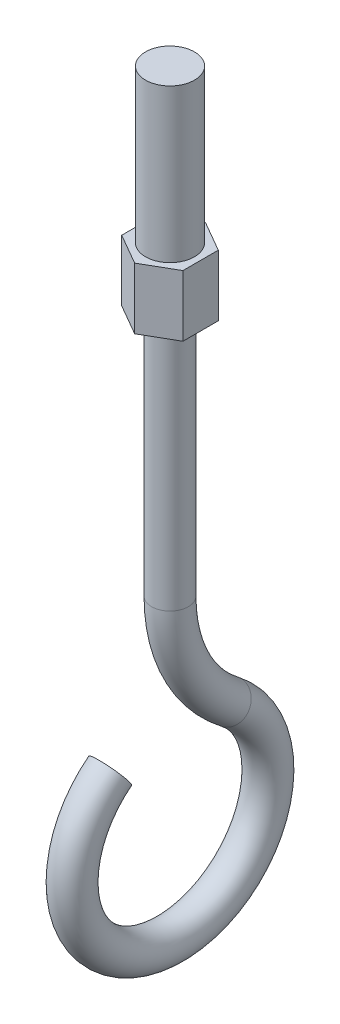
ISO-10303-21;
HEADER;
FILE_DESCRIPTION(('STEP AP214'),'2;1');
FILE_NAME('part.step','',(''),(''),'','','');
FILE_SCHEMA(('AUTOMOTIVE_DESIGN { 1 0 10303 214 1 1 1 1 }'));
ENDSEC;
DATA;
#1=APPLICATION_CONTEXT('core data for automotive mechanical design processes');
#2=APPLICATION_PROTOCOL_DEFINITION('international standard','automotive_design',2000,#1);
#3=PRODUCT_CONTEXT('',#1,'mechanical');
#4=PRODUCT('Part','Part','',(#3));
#5=PRODUCT_RELATED_PRODUCT_CATEGORY('part','',(#4));
#6=PRODUCT_DEFINITION_FORMATION('','',#4);
#7=PRODUCT_DEFINITION_CONTEXT('part definition',#1,'design');
#8=PRODUCT_DEFINITION('design','',#6,#7);
#9=PRODUCT_DEFINITION_SHAPE('','',#8);
#10=(LENGTH_UNIT() NAMED_UNIT(*) SI_UNIT(.MILLI.,.METRE.));
#11=(NAMED_UNIT(*) PLANE_ANGLE_UNIT() SI_UNIT($,.RADIAN.));
#12=(NAMED_UNIT(*) SI_UNIT($,.STERADIAN.) SOLID_ANGLE_UNIT());
#13=UNCERTAINTY_MEASURE_WITH_UNIT(LENGTH_MEASURE(1.E-05),#10,'distance_accuracy_value','');
#14=(GEOMETRIC_REPRESENTATION_CONTEXT(3) GLOBAL_UNCERTAINTY_ASSIGNED_CONTEXT((#13)) GLOBAL_UNIT_ASSIGNED_CONTEXT((#10,
#11,#12)) REPRESENTATION_CONTEXT('',''));
#15=CARTESIAN_POINT('',(0.,0.,0.));
#16=DIRECTION('',(0.,0.,1.));
#17=DIRECTION('',(1.,0.,0.));
#18=AXIS2_PLACEMENT_3D('',#15,#16,#17);
#19=CARTESIAN_POINT('',(0.,-75.9647043265553,12.390243902439));
#20=DIRECTION('',(0.,-0.609756097560976,0.79258911264741));
#21=DIRECTION('',(0.,-0.79258911264741,-0.609756097560976));
#22=AXIS2_PLACEMENT_3D('',#19,#20,#21);
#23=PLANE('',#22);
#24=CARTESIAN_POINT('',(0.,-75.9647043265553,12.390243902439));
#25=DIRECTION('',(0.,-0.609756097560976,0.79258911264741));
#26=DIRECTION('',(0.,-0.79258911264741,-0.609756097560976));
#27=AXIS2_PLACEMENT_3D('',#24,#25,#26);
#28=CIRCLE('',#27,3.81);
#29=CARTESIAN_POINT('',(0.,-78.9844688457419,10.0670731707317));
#30=VERTEX_POINT('',#29);
#31=EDGE_CURVE('E12',#30,#30,#28,.T.);
#32=ORIENTED_EDGE('',*,*,#31,.F.);
#33=EDGE_LOOP('',(#32));
#34=FACE_BOUND('',#33,.T.);
#35=ADVANCED_FACE('F46',(#34),#23,.F.);
#36=CARTESIAN_POINT('',(0.,0.,0.));
#37=DIRECTION('',(0.,-1.,0.));
#38=DIRECTION('',(0.,0.,-1.));
#39=AXIS2_PLACEMENT_3D('',#36,#37,#38);
#40=CYLINDRICAL_SURFACE('',#39,3.81);
#41=CARTESIAN_POINT('',(0.,-50.8,0.));
#42=DIRECTION('',(0.,1.,0.));
#43=DIRECTION('',(0.,0.,1.));
#44=AXIS2_PLACEMENT_3D('',#41,#42,#43);
#45=CIRCLE('',#44,3.81);
#46=CARTESIAN_POINT('',(0.,-50.8,3.81));
#47=VERTEX_POINT('',#46);
#48=EDGE_CURVE('E158',#47,#47,#45,.T.);
#49=ORIENTED_EDGE('',*,*,#48,.T.);
#50=EDGE_LOOP('',(#49));
#51=FACE_BOUND('',#50,.T.);
#52=CARTESIAN_POINT('',(0.,0.,0.));
#53=DIRECTION('',(0.,1.,0.));
#54=DIRECTION('',(0.,0.,1.));
#55=AXIS2_PLACEMENT_3D('',#52,#53,#54);
#56=CIRCLE('',#55,3.81);
#57=CARTESIAN_POINT('',(0.,0.,3.81));
#58=VERTEX_POINT('',#57);
#59=EDGE_CURVE('E155',#58,#58,#56,.T.);
#60=ORIENTED_EDGE('',*,*,#59,.F.);
#61=EDGE_LOOP('',(#60));
#62=FACE_BOUND('',#61,.T.);
#63=ADVANCED_FACE('F176',(#51,#62),#40,.T.);
#64=CARTESIAN_POINT('',(0.,-50.8,-31.75));
#65=DIRECTION('',(1.,0.,0.));
#66=DIRECTION('',(0.,0.,-1.));
#67=AXIS2_PLACEMENT_3D('',#64,#65,#66);
#68=TOROIDAL_SURFACE('',#67,31.75,3.81);
#69=CARTESIAN_POINT('',(0.,-75.9647043265553,-12.390243902439));
#70=DIRECTION('',(0.,0.609756097560976,0.79258911264741));
#71=DIRECTION('',(0.,-0.79258911264741,0.609756097560976));
#72=AXIS2_PLACEMENT_3D('',#69,#70,#71);
#73=CIRCLE('',#72,3.81);
#74=CARTESIAN_POINT('',(0.,-78.9844688457419,-10.0670731707317));
#75=VERTEX_POINT('',#74);
#76=EDGE_CURVE('E54',#75,#75,#73,.T.);
#77=CARTESIAN_POINT('',(0.,-50.8,-31.75));
#78=DIRECTION('',(1.,0.,0.));
#79=DIRECTION('',(0.,0.,-1.));
#80=AXIS2_PLACEMENT_3D('',#77,#78,#79);
#81=CIRCLE('',#80,35.56);
#82=EDGE_CURVE('',#47,#75,#81,.T.);
#83=ORIENTED_EDGE('',*,*,#48,.F.);
#84=ORIENTED_EDGE('',*,*,#76,.T.);
#85=ORIENTED_EDGE('',*,*,#82,.T.);
#86=ORIENTED_EDGE('',*,*,#82,.F.);
#87=EDGE_LOOP('',(#83,#85,#84,#86));
#88=FACE_BOUND('',#87,.T.);
#89=ADVANCED_FACE('F163',(#88),#68,.T.);
#90=CARTESIAN_POINT('',(0.,-92.0701150955507,0.));
#91=DIRECTION('',(-1.,0.,0.));
#92=DIRECTION('',(0.,0.,1.));
#93=AXIS2_PLACEMENT_3D('',#90,#91,#92);
#94=TOROIDAL_SURFACE('',#93,20.32,3.81);
#95=ORIENTED_EDGE('',*,*,#31,.T.);
#96=EDGE_LOOP('',(#95));
#97=FACE_BOUND('',#96,.T.);
#98=ORIENTED_EDGE('',*,*,#76,.F.);
#99=EDGE_LOOP('',(#98));
#100=FACE_BOUND('',#99,.T.);
#101=ADVANCED_FACE('F166',(#97,#100),#94,.T.);
#102=CARTESIAN_POINT('',(0.,0.,0.));
#103=DIRECTION('',(0.,1.,0.));
#104=DIRECTION('',(0.,0.,1.));
#105=AXIS2_PLACEMENT_3D('',#102,#103,#104);
#106=PLANE('',#105);
#107=ORIENTED_EDGE('',*,*,#59,.T.);
#108=EDGE_LOOP('',(#107));
#109=FACE_BOUND('',#108,.T.);
#110=DIRECTION('',(0.,0.,-1.));
#111=VECTOR('',#110,1.);
#112=CARTESIAN_POINT('',(6.35,0.,3.66617420935413));
#113=LINE('',#112,#111);
#114=CARTESIAN_POINT('',(6.35,0.,3.66617420935413));
#115=VERTEX_POINT('',#114);
#116=CARTESIAN_POINT('',(6.35,0.,-3.66617420935412));
#117=VERTEX_POINT('',#116);
#118=EDGE_CURVE('E132',#115,#117,#113,.T.);
#119=ORIENTED_EDGE('',*,*,#118,.F.);
#120=DIRECTION('',(0.866025403784439,0.,-0.5));
#121=VECTOR('',#120,1.);
#122=CARTESIAN_POINT('',(0.,0.,7.33234841870825));
#123=LINE('',#122,#121);
#124=CARTESIAN_POINT('',(0.,0.,7.33234841870825));
#125=VERTEX_POINT('',#124);
#126=EDGE_CURVE('E91',#125,#115,#123,.T.);
#127=ORIENTED_EDGE('',*,*,#126,.F.);
#128=DIRECTION('',(0.866025403784438,0.,0.5));
#129=VECTOR('',#128,1.);
#130=CARTESIAN_POINT('',(-6.35,0.,3.66617420935413));
#131=LINE('',#130,#129);
#132=CARTESIAN_POINT('',(-6.35,0.,3.66617420935413));
#133=VERTEX_POINT('',#132);
#134=EDGE_CURVE('E85',#133,#125,#131,.T.);
#135=ORIENTED_EDGE('',*,*,#134,.F.);
#136=DIRECTION('',(0.,0.,1.));
#137=VECTOR('',#136,1.);
#138=CARTESIAN_POINT('',(-6.35,0.,-3.66617420935413));
#139=LINE('',#138,#137);
#140=CARTESIAN_POINT('',(-6.35,0.,-3.66617420935413));
#141=VERTEX_POINT('',#140);
#142=EDGE_CURVE('E122',#141,#133,#139,.T.);
#143=ORIENTED_EDGE('',*,*,#142,.F.);
#144=DIRECTION('',(-0.866025403784439,0.,0.5));
#145=VECTOR('',#144,1.);
#146=CARTESIAN_POINT('',(0.,0.,-7.33234841870825));
#147=LINE('',#146,#145);
#148=CARTESIAN_POINT('',(0.,0.,-7.33234841870825));
#149=VERTEX_POINT('',#148);
#150=EDGE_CURVE('E138',#149,#141,#147,.T.);
#151=ORIENTED_EDGE('',*,*,#150,.F.);
#152=DIRECTION('',(-0.866025403784438,0.,-0.5));
#153=VECTOR('',#152,1.);
#154=CARTESIAN_POINT('',(6.35,0.,-3.66617420935412));
#155=LINE('',#154,#153);
#156=EDGE_CURVE('E135',#117,#149,#155,.T.);
#157=ORIENTED_EDGE('',*,*,#156,.F.);
#158=EDGE_LOOP('',(#119,#127,#135,#143,#151,#157));
#159=FACE_BOUND('',#158,.T.);
#160=ADVANCED_FACE('F168',(#109,#159),#106,.F.);
#161=CARTESIAN_POINT('',(0.,12.7,0.));
#162=DIRECTION('',(0.,1.,0.));
#163=DIRECTION('',(0.,0.,1.));
#164=AXIS2_PLACEMENT_3D('',#161,#162,#163);
#165=PLANE('',#164);
#166=DIRECTION('',(0.,0.,-1.));
#167=VECTOR('',#166,1.);
#168=CARTESIAN_POINT('',(6.35,12.7,3.66617420935413));
#169=LINE('',#168,#167);
#170=CARTESIAN_POINT('',(6.35,12.7,3.66617420935413));
#171=VERTEX_POINT('',#170);
#172=CARTESIAN_POINT('',(6.35,12.7,-3.66617420935412));
#173=VERTEX_POINT('',#172);
#174=EDGE_CURVE('E143',#171,#173,#169,.T.);
#175=ORIENTED_EDGE('',*,*,#174,.T.);
#176=DIRECTION('',(-0.866025403784438,0.,-0.5));
#177=VECTOR('',#176,1.);
#178=CARTESIAN_POINT('',(6.35,12.7,-3.66617420935412));
#179=LINE('',#178,#177);
#180=CARTESIAN_POINT('',(0.,12.7,-7.33234841870825));
#181=VERTEX_POINT('',#180);
#182=EDGE_CURVE('E100',#173,#181,#179,.T.);
#183=ORIENTED_EDGE('',*,*,#182,.T.);
#184=DIRECTION('',(-0.866025403784439,0.,0.5));
#185=VECTOR('',#184,1.);
#186=CARTESIAN_POINT('',(0.,12.7,-7.33234841870825));
#187=LINE('',#186,#185);
#188=CARTESIAN_POINT('',(-6.35,12.7,-3.66617420935412));
#189=VERTEX_POINT('',#188);
#190=EDGE_CURVE('E114',#181,#189,#187,.T.);
#191=ORIENTED_EDGE('',*,*,#190,.T.);
#192=DIRECTION('',(0.,0.,1.));
#193=VECTOR('',#192,1.);
#194=CARTESIAN_POINT('',(-6.35,12.7,-3.66617420935412));
#195=LINE('',#194,#193);
#196=CARTESIAN_POINT('',(-6.35,12.7,3.66617420935413));
#197=VERTEX_POINT('',#196);
#198=EDGE_CURVE('E107',#189,#197,#195,.T.);
#199=ORIENTED_EDGE('',*,*,#198,.T.);
#200=DIRECTION('',(0.866025403784438,0.,0.5));
#201=VECTOR('',#200,1.);
#202=CARTESIAN_POINT('',(-6.35,12.7,3.66617420935413));
#203=LINE('',#202,#201);
#204=CARTESIAN_POINT('',(0.,12.7,7.33234841870825));
#205=VERTEX_POINT('',#204);
#206=EDGE_CURVE('E112',#197,#205,#203,.T.);
#207=ORIENTED_EDGE('',*,*,#206,.T.);
#208=DIRECTION('',(0.866025403784439,0.,-0.5));
#209=VECTOR('',#208,1.);
#210=CARTESIAN_POINT('',(0.,12.7,7.33234841870825));
#211=LINE('',#210,#209);
#212=EDGE_CURVE('E62',#205,#171,#211,.T.);
#213=ORIENTED_EDGE('',*,*,#212,.T.);
#214=EDGE_LOOP('',(#175,#183,#191,#199,#207,#213));
#215=FACE_BOUND('',#214,.T.);
#216=CARTESIAN_POINT('',(0.,12.7,0.));
#217=DIRECTION('',(0.,1.,0.));
#218=DIRECTION('',(0.,0.,1.));
#219=AXIS2_PLACEMENT_3D('',#216,#217,#218);
#220=CIRCLE('',#219,5.08);
#221=CARTESIAN_POINT('',(0.,12.7,5.08));
#222=VERTEX_POINT('',#221);
#223=EDGE_CURVE('E136',#222,#222,#220,.T.);
#224=ORIENTED_EDGE('',*,*,#223,.F.);
#225=EDGE_LOOP('',(#224));
#226=FACE_BOUND('',#225,.T.);
#227=ADVANCED_FACE('F109',(#215,#226),#165,.T.);
#228=CARTESIAN_POINT('',(6.35,12.7,3.66617420935413));
#229=DIRECTION('',(-1.,0.,0.));
#230=DIRECTION('',(0.,0.,1.));
#231=AXIS2_PLACEMENT_3D('',#228,#229,#230);
#232=PLANE('',#231);
#233=ORIENTED_EDGE('',*,*,#118,.T.);
#234=DIRECTION('',(0.,-1.,0.));
#235=VECTOR('',#234,1.);
#236=CARTESIAN_POINT('',(6.35,12.7,-3.66617420935412));
#237=LINE('',#236,#235);
#238=EDGE_CURVE('E150',#173,#117,#237,.T.);
#239=ORIENTED_EDGE('',*,*,#238,.F.);
#240=ORIENTED_EDGE('',*,*,#174,.F.);
#241=DIRECTION('',(0.,-1.,0.));
#242=VECTOR('',#241,1.);
#243=CARTESIAN_POINT('',(6.35,12.7,3.66617420935413));
#244=LINE('',#243,#242);
#245=EDGE_CURVE('E128',#171,#115,#244,.T.);
#246=ORIENTED_EDGE('',*,*,#245,.T.);
#247=EDGE_LOOP('',(#233,#239,#240,#246));
#248=FACE_BOUND('',#247,.T.);
#249=ADVANCED_FACE('F191',(#248),#232,.F.);
#250=CARTESIAN_POINT('',(6.35,12.7,-3.66617420935412));
#251=DIRECTION('',(-0.5,0.,0.866025403784438));
#252=DIRECTION('',(0.866025403784439,0.,0.5));
#253=AXIS2_PLACEMENT_3D('',#250,#251,#252);
#254=PLANE('',#253);
#255=ORIENTED_EDGE('',*,*,#156,.T.);
#256=DIRECTION('',(0.,-1.,0.));
#257=VECTOR('',#256,1.);
#258=CARTESIAN_POINT('',(0.,12.7,-7.33234841870825));
#259=LINE('',#258,#257);
#260=EDGE_CURVE('E147',#181,#149,#259,.T.);
#261=ORIENTED_EDGE('',*,*,#260,.F.);
#262=ORIENTED_EDGE('',*,*,#182,.F.);
#263=ORIENTED_EDGE('',*,*,#238,.T.);
#264=EDGE_LOOP('',(#255,#261,#262,#263));
#265=FACE_BOUND('',#264,.T.);
#266=ADVANCED_FACE('F194',(#265),#254,.F.);
#267=CARTESIAN_POINT('',(0.,12.7,-7.33234841870825));
#268=DIRECTION('',(0.5,0.,0.866025403784439));
#269=DIRECTION('',(0.866025403784439,0.,-0.5));
#270=AXIS2_PLACEMENT_3D('',#267,#268,#269);
#271=PLANE('',#270);
#272=ORIENTED_EDGE('',*,*,#150,.T.);
#273=DIRECTION('',(0.,-1.,0.));
#274=VECTOR('',#273,1.);
#275=CARTESIAN_POINT('',(-6.35,12.7,-3.66617420935412));
#276=LINE('',#275,#274);
#277=EDGE_CURVE('E123',#189,#141,#276,.T.);
#278=ORIENTED_EDGE('',*,*,#277,.F.);
#279=ORIENTED_EDGE('',*,*,#190,.F.);
#280=ORIENTED_EDGE('',*,*,#260,.T.);
#281=EDGE_LOOP('',(#272,#278,#279,#280));
#282=FACE_BOUND('',#281,.T.);
#283=ADVANCED_FACE('F198',(#282),#271,.F.);
#284=CARTESIAN_POINT('',(-6.35,12.7,-3.66617420935412));
#285=DIRECTION('',(1.,0.,0.));
#286=DIRECTION('',(0.,0.,-1.));
#287=AXIS2_PLACEMENT_3D('',#284,#285,#286);
#288=PLANE('',#287);
#289=ORIENTED_EDGE('',*,*,#142,.T.);
#290=DIRECTION('',(0.,-1.,0.));
#291=VECTOR('',#290,1.);
#292=CARTESIAN_POINT('',(-6.35,12.7,3.66617420935413));
#293=LINE('',#292,#291);
#294=EDGE_CURVE('E119',#197,#133,#293,.T.);
#295=ORIENTED_EDGE('',*,*,#294,.F.);
#296=ORIENTED_EDGE('',*,*,#198,.F.);
#297=ORIENTED_EDGE('',*,*,#277,.T.);
#298=EDGE_LOOP('',(#289,#295,#296,#297));
#299=FACE_BOUND('',#298,.T.);
#300=ADVANCED_FACE('F120',(#299),#288,.F.);
#301=CARTESIAN_POINT('',(-6.35,12.7,3.66617420935413));
#302=DIRECTION('',(0.5,0.,-0.866025403784438));
#303=DIRECTION('',(-0.866025403784439,0.,-0.5));
#304=AXIS2_PLACEMENT_3D('',#301,#302,#303);
#305=PLANE('',#304);
#306=ORIENTED_EDGE('',*,*,#134,.T.);
#307=DIRECTION('',(0.,-1.,0.));
#308=VECTOR('',#307,1.);
#309=CARTESIAN_POINT('',(0.,12.7,7.33234841870825));
#310=LINE('',#309,#308);
#311=EDGE_CURVE('E124',#205,#125,#310,.T.);
#312=ORIENTED_EDGE('',*,*,#311,.F.);
#313=ORIENTED_EDGE('',*,*,#206,.F.);
#314=ORIENTED_EDGE('',*,*,#294,.T.);
#315=EDGE_LOOP('',(#306,#312,#313,#314));
#316=FACE_BOUND('',#315,.T.);
#317=ADVANCED_FACE('F126',(#316),#305,.F.);
#318=CARTESIAN_POINT('',(0.,12.7,7.33234841870825));
#319=DIRECTION('',(-0.5,0.,-0.866025403784439));
#320=DIRECTION('',(-0.866025403784439,0.,0.5));
#321=AXIS2_PLACEMENT_3D('',#318,#319,#320);
#322=PLANE('',#321);
#323=ORIENTED_EDGE('',*,*,#126,.T.);
#324=ORIENTED_EDGE('',*,*,#245,.F.);
#325=ORIENTED_EDGE('',*,*,#212,.F.);
#326=ORIENTED_EDGE('',*,*,#311,.T.);
#327=EDGE_LOOP('',(#323,#324,#325,#326));
#328=FACE_BOUND('',#327,.T.);
#329=ADVANCED_FACE('F186',(#328),#322,.F.);
#330=CARTESIAN_POINT('',(0.,44.45,0.));
#331=DIRECTION('',(0.,1.,0.));
#332=DIRECTION('',(0.,0.,1.));
#333=AXIS2_PLACEMENT_3D('',#330,#331,#332);
#334=PLANE('',#333);
#335=CARTESIAN_POINT('',(0.,44.45,0.));
#336=DIRECTION('',(0.,1.,0.));
#337=DIRECTION('',(0.,0.,1.));
#338=AXIS2_PLACEMENT_3D('',#335,#336,#337);
#339=CIRCLE('',#338,5.08);
#340=CARTESIAN_POINT('',(0.,44.45,5.08000000000001));
#341=VERTEX_POINT('',#340);
#342=EDGE_CURVE('E152',#341,#341,#339,.T.);
#343=ORIENTED_EDGE('',*,*,#342,.T.);
#344=EDGE_LOOP('',(#343));
#345=FACE_BOUND('',#344,.T.);
#346=ADVANCED_FACE('F182',(#345),#334,.T.);
#347=CARTESIAN_POINT('',(0.,90.5684097937107,0.));
#348=DIRECTION('',(0.,-1.,0.));
#349=DIRECTION('',(0.,0.,-1.));
#350=AXIS2_PLACEMENT_3D('',#347,#348,#349);
#351=CYLINDRICAL_SURFACE('',#350,5.08);
#352=ORIENTED_EDGE('',*,*,#223,.T.);
#353=EDGE_LOOP('',(#352));
#354=FACE_BOUND('',#353,.T.);
#355=ORIENTED_EDGE('',*,*,#342,.F.);
#356=EDGE_LOOP('',(#355));
#357=FACE_BOUND('',#356,.T.);
#358=ADVANCED_FACE('F185',(#354,#357),#351,.T.);
#359=CLOSED_SHELL('',(#35,#63,#89,#101,#160,#227,#249,#266,#283,#300,#317,#329,#346,#358));
#360=MANIFOLD_SOLID_BREP('B2',#359);
#361=ADVANCED_BREP_SHAPE_REPRESENTATION('',(#18,#360),#14);
#362=SHAPE_DEFINITION_REPRESENTATION(#9,#361);
ENDSEC;
END-ISO-10303-21;
